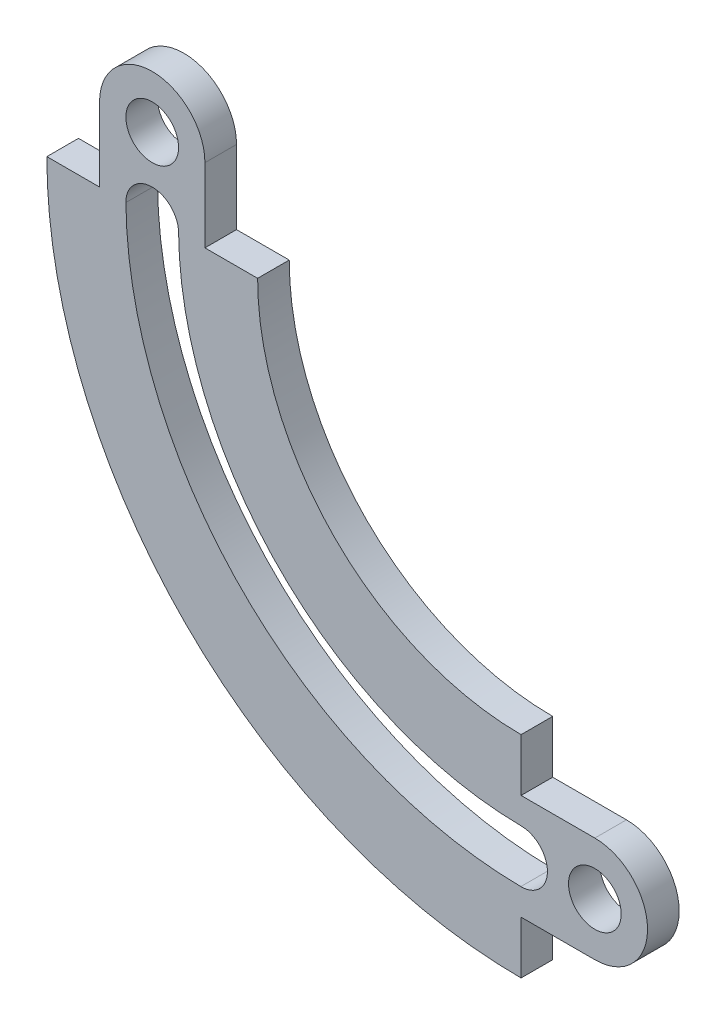
ISO-10303-21;
HEADER;
FILE_DESCRIPTION(('STEP AP214'),'2;1');
FILE_NAME('part.step','',(''),(''),'','','');
FILE_SCHEMA(('AUTOMOTIVE_DESIGN { 1 0 10303 214 1 1 1 1 }'));
ENDSEC;
DATA;
#1=APPLICATION_CONTEXT('core data for automotive mechanical design processes');
#2=APPLICATION_PROTOCOL_DEFINITION('international standard','automotive_design',2000,#1);
#3=PRODUCT_CONTEXT('',#1,'mechanical');
#4=PRODUCT('Part','Part','',(#3));
#5=PRODUCT_RELATED_PRODUCT_CATEGORY('part','',(#4));
#6=PRODUCT_DEFINITION_FORMATION('','',#4);
#7=PRODUCT_DEFINITION_CONTEXT('part definition',#1,'design');
#8=PRODUCT_DEFINITION('design','',#6,#7);
#9=PRODUCT_DEFINITION_SHAPE('','',#8);
#10=(LENGTH_UNIT() NAMED_UNIT(*) SI_UNIT(.MILLI.,.METRE.));
#11=(NAMED_UNIT(*) PLANE_ANGLE_UNIT() SI_UNIT($,.RADIAN.));
#12=(NAMED_UNIT(*) SI_UNIT($,.STERADIAN.) SOLID_ANGLE_UNIT());
#13=UNCERTAINTY_MEASURE_WITH_UNIT(LENGTH_MEASURE(1.E-05),#10,'distance_accuracy_value','');
#14=(GEOMETRIC_REPRESENTATION_CONTEXT(3) GLOBAL_UNCERTAINTY_ASSIGNED_CONTEXT((#13)) GLOBAL_UNIT_ASSIGNED_CONTEXT((#10,
#11,#12)) REPRESENTATION_CONTEXT('',''));
#15=CARTESIAN_POINT('',(0.,0.,0.));
#16=DIRECTION('',(0.,0.,1.));
#17=DIRECTION('',(1.,0.,0.));
#18=AXIS2_PLACEMENT_3D('',#15,#16,#17);
#19=CARTESIAN_POINT('',(0.,89.9999999999979,6.));
#20=DIRECTION('',(0.,0.,1.));
#21=DIRECTION('',(1.,0.,0.));
#22=AXIS2_PLACEMENT_3D('',#19,#20,#21);
#23=PLANE('',#22);
#24=CARTESIAN_POINT('',(-69.9999999999955,103.999999999991,6.));
#25=DIRECTION('',(0.,0.,1.));
#26=DIRECTION('',(1.,0.,0.));
#27=AXIS2_PLACEMENT_3D('',#24,#25,#26);
#28=CIRCLE('',#27,5.00000000000001);
#29=CARTESIAN_POINT('',(-64.9999999999955,103.999999999991,6.));
#30=VERTEX_POINT('',#29);
#31=EDGE_CURVE('E188',#30,#30,#28,.T.);
#32=ORIENTED_EDGE('',*,*,#31,.F.);
#33=EDGE_LOOP('',(#32));
#34=FACE_BOUND('',#33,.T.);
#35=CARTESIAN_POINT('',(14.,20.,6.));
#36=DIRECTION('',(0.,0.,1.));
#37=DIRECTION('',(1.,0.,0.));
#38=AXIS2_PLACEMENT_3D('',#35,#36,#37);
#39=CIRCLE('',#38,5.);
#40=CARTESIAN_POINT('',(19.,20.,6.));
#41=VERTEX_POINT('',#40);
#42=EDGE_CURVE('E168',#41,#41,#39,.T.);
#43=ORIENTED_EDGE('',*,*,#42,.F.);
#44=EDGE_LOOP('',(#43));
#45=FACE_BOUND('',#44,.T.);
#46=CARTESIAN_POINT('',(0.,89.9999999999979,6.));
#47=DIRECTION('',(0.,0.,-1.));
#48=DIRECTION('',(1.,0.,0.));
#49=AXIS2_PLACEMENT_3D('',#46,#47,#48);
#50=CIRCLE('',#49,49.9999999999979);
#51=CARTESIAN_POINT('',(0.,40.,6.));
#52=VERTEX_POINT('',#51);
#53=CARTESIAN_POINT('',(-49.9999999999979,89.9999999999978,6.));
#54=VERTEX_POINT('',#53);
#55=EDGE_CURVE('E200',#52,#54,#50,.T.);
#56=ORIENTED_EDGE('',*,*,#55,.T.);
#57=DIRECTION('',(-1.,0.,0.));
#58=VECTOR('',#57,1.);
#59=CARTESIAN_POINT('',(-49.9999999999979,89.9999999999978,6.));
#60=LINE('',#59,#58);
#61=CARTESIAN_POINT('',(-59.9999999999979,89.9999999999978,6.));
#62=VERTEX_POINT('',#61);
#63=EDGE_CURVE('E203',#54,#62,#60,.T.);
#64=ORIENTED_EDGE('',*,*,#63,.T.);
#65=DIRECTION('',(0.,1.,0.));
#66=VECTOR('',#65,1.);
#67=CARTESIAN_POINT('',(-59.9999999999979,89.9999999999978,6.));
#68=LINE('',#67,#66);
#69=CARTESIAN_POINT('',(-59.9999999999979,103.999999999998,6.));
#70=VERTEX_POINT('',#69);
#71=EDGE_CURVE('E206',#62,#70,#68,.T.);
#72=ORIENTED_EDGE('',*,*,#71,.T.);
#73=CARTESIAN_POINT('',(-69.9999999999979,103.999999999998,6.));
#74=DIRECTION('',(0.,0.,1.));
#75=DIRECTION('',(-1.,0.,0.));
#76=AXIS2_PLACEMENT_3D('',#73,#74,#75);
#77=CIRCLE('',#76,10.);
#78=CARTESIAN_POINT('',(-79.9999999999979,103.999999999998,6.));
#79=VERTEX_POINT('',#78);
#80=EDGE_CURVE('E208',#70,#79,#77,.T.);
#81=ORIENTED_EDGE('',*,*,#80,.T.);
#82=DIRECTION('',(0.,-1.,0.));
#83=VECTOR('',#82,1.);
#84=CARTESIAN_POINT('',(-79.9999999999979,89.9999999999978,6.));
#85=LINE('',#84,#83);
#86=CARTESIAN_POINT('',(-79.9999999999979,89.9999999999978,6.));
#87=VERTEX_POINT('',#86);
#88=EDGE_CURVE('E210',#79,#87,#85,.T.);
#89=ORIENTED_EDGE('',*,*,#88,.T.);
#90=DIRECTION('',(-1.,3.87190279837876E-13,0.));
#91=VECTOR('',#90,1.);
#92=CARTESIAN_POINT('',(-79.9999999999979,89.9999999999978,6.));
#93=LINE('',#92,#91);
#94=CARTESIAN_POINT('',(-90.0000000000017,90.0000000000017,6.));
#95=VERTEX_POINT('',#94);
#96=EDGE_CURVE('E212',#87,#95,#93,.T.);
#97=ORIENTED_EDGE('',*,*,#96,.T.);
#98=CARTESIAN_POINT('',(-3.83026943495679E-12,89.9999999999979,6.));
#99=DIRECTION('',(0.,0.,1.));
#100=DIRECTION('',(1.,0.,0.));
#101=AXIS2_PLACEMENT_3D('',#98,#99,#100);
#102=CIRCLE('',#101,89.9999999999979);
#103=CARTESIAN_POINT('',(0.,0.,6.));
#104=VERTEX_POINT('',#103);
#105=EDGE_CURVE('E214',#95,#104,#102,.T.);
#106=ORIENTED_EDGE('',*,*,#105,.T.);
#107=DIRECTION('',(0.,1.,0.));
#108=VECTOR('',#107,1.);
#109=CARTESIAN_POINT('',(0.,10.,6.));
#110=LINE('',#109,#108);
#111=CARTESIAN_POINT('',(0.,10.,6.));
#112=VERTEX_POINT('',#111);
#113=EDGE_CURVE('E216',#104,#112,#110,.T.);
#114=ORIENTED_EDGE('',*,*,#113,.T.);
#115=DIRECTION('',(1.,0.,0.));
#116=VECTOR('',#115,1.);
#117=CARTESIAN_POINT('',(0.,10.,6.));
#118=LINE('',#117,#116);
#119=CARTESIAN_POINT('',(14.,10.,6.));
#120=VERTEX_POINT('',#119);
#121=EDGE_CURVE('E218',#112,#120,#118,.T.);
#122=ORIENTED_EDGE('',*,*,#121,.T.);
#123=CARTESIAN_POINT('',(14.,20.,6.));
#124=DIRECTION('',(0.,0.,1.));
#125=DIRECTION('',(-1.,0.,0.));
#126=AXIS2_PLACEMENT_3D('',#123,#124,#125);
#127=CIRCLE('',#126,10.);
#128=CARTESIAN_POINT('',(14.,30.,6.));
#129=VERTEX_POINT('',#128);
#130=EDGE_CURVE('E220',#120,#129,#127,.T.);
#131=ORIENTED_EDGE('',*,*,#130,.T.);
#132=DIRECTION('',(-1.,0.,0.));
#133=VECTOR('',#132,1.);
#134=CARTESIAN_POINT('',(0.,30.,6.));
#135=LINE('',#134,#133);
#136=CARTESIAN_POINT('',(0.,30.,6.));
#137=VERTEX_POINT('',#136);
#138=EDGE_CURVE('E222',#129,#137,#135,.T.);
#139=ORIENTED_EDGE('',*,*,#138,.T.);
#140=DIRECTION('',(0.,1.,0.));
#141=VECTOR('',#140,1.);
#142=CARTESIAN_POINT('',(0.,40.,6.));
#143=LINE('',#142,#141);
#144=EDGE_CURVE('E224',#137,#52,#143,.T.);
#145=ORIENTED_EDGE('',*,*,#144,.T.);
#146=EDGE_LOOP('',(#56,#64,#72,#81,#89,#97,#106,#114,#122,#131,#139,#145));
#147=FACE_BOUND('',#146,.T.);
#148=CARTESIAN_POINT('',(0.67932122736538,90.6793212273633,6.));
#149=DIRECTION('',(0.,0.,1.));
#150=DIRECTION('',(1.,0.,0.));
#151=AXIS2_PLACEMENT_3D('',#148,#149,#150);
#152=CIRCLE('',#151,75.6823548188695);
#153=CARTESIAN_POINT('',(-74.9995381420888,89.9519454870217,6.));
#154=VERTEX_POINT('',#153);
#155=CARTESIAN_POINT('',(-0.0480545129761748,15.0004618579091,6.));
#156=VERTEX_POINT('',#155);
#157=EDGE_CURVE('E160',#154,#156,#152,.T.);
#158=ORIENTED_EDGE('',*,*,#157,.F.);
#159=CARTESIAN_POINT('',(-69.9997690710433,89.9999999999978,6.));
#160=DIRECTION('',(0.,0.,1.));
#161=DIRECTION('',(1.,0.,0.));
#162=AXIS2_PLACEMENT_3D('',#159,#160,#161);
#163=CIRCLE('',#162,5.);
#164=CARTESIAN_POINT('',(-64.9999999999979,90.048054512974,6.));
#165=VERTEX_POINT('',#164);
#166=EDGE_CURVE('E152',#165,#154,#163,.T.);
#167=ORIENTED_EDGE('',*,*,#166,.F.);
#168=CARTESIAN_POINT('',(0.67932122736538,90.6793212273633,6.));
#169=DIRECTION('',(0.,0.,-1.));
#170=DIRECTION('',(1.,0.,0.));
#171=AXIS2_PLACEMENT_3D('',#168,#169,#170);
#172=CIRCLE('',#171,65.6823548188695);
#173=CARTESIAN_POINT('',(0.048054512976134,25.,6.));
#174=VERTEX_POINT('',#173);
#175=EDGE_CURVE('E174',#174,#165,#172,.T.);
#176=ORIENTED_EDGE('',*,*,#175,.F.);
#177=CARTESIAN_POINT('',(0.,20.0002309289546,6.));
#178=DIRECTION('',(0.,0.,1.));
#179=DIRECTION('',(1.,0.,0.));
#180=AXIS2_PLACEMENT_3D('',#177,#178,#179);
#181=CIRCLE('',#180,5.);
#182=EDGE_CURVE('E172',#156,#174,#181,.T.);
#183=ORIENTED_EDGE('',*,*,#182,.F.);
#184=EDGE_LOOP('',(#158,#167,#176,#183));
#185=FACE_BOUND('',#184,.T.);
#186=ADVANCED_FACE('F39',(#34,#45,#147,#185),#23,.T.);
#187=CARTESIAN_POINT('',(0.,89.9999999999979,0.));
#188=DIRECTION('',(0.,0.,1.));
#189=DIRECTION('',(1.,0.,0.));
#190=AXIS2_PLACEMENT_3D('',#187,#188,#189);
#191=PLANE('',#190);
#192=CARTESIAN_POINT('',(0.,89.9999999999979,0.));
#193=DIRECTION('',(0.,0.,-1.));
#194=DIRECTION('',(1.,0.,0.));
#195=AXIS2_PLACEMENT_3D('',#192,#193,#194);
#196=CIRCLE('',#195,49.9999999999979);
#197=CARTESIAN_POINT('',(0.,40.,0.));
#198=VERTEX_POINT('',#197);
#199=CARTESIAN_POINT('',(-49.9999999999979,89.9999999999978,0.));
#200=VERTEX_POINT('',#199);
#201=EDGE_CURVE('E191',#198,#200,#196,.T.);
#202=ORIENTED_EDGE('',*,*,#201,.F.);
#203=DIRECTION('',(0.,1.,0.));
#204=VECTOR('',#203,1.);
#205=CARTESIAN_POINT('',(0.,40.,0.));
#206=LINE('',#205,#204);
#207=CARTESIAN_POINT('',(0.,30.,0.));
#208=VERTEX_POINT('',#207);
#209=EDGE_CURVE('E204',#208,#198,#206,.T.);
#210=ORIENTED_EDGE('',*,*,#209,.F.);
#211=DIRECTION('',(-1.,0.,0.));
#212=VECTOR('',#211,1.);
#213=CARTESIAN_POINT('',(0.,30.,0.));
#214=LINE('',#213,#212);
#215=CARTESIAN_POINT('',(14.,30.,0.));
#216=VERTEX_POINT('',#215);
#217=EDGE_CURVE('E247',#216,#208,#214,.T.);
#218=ORIENTED_EDGE('',*,*,#217,.F.);
#219=CARTESIAN_POINT('',(14.,20.,0.));
#220=DIRECTION('',(0.,0.,1.));
#221=DIRECTION('',(-1.,0.,0.));
#222=AXIS2_PLACEMENT_3D('',#219,#220,#221);
#223=CIRCLE('',#222,10.);
#224=CARTESIAN_POINT('',(14.,10.,0.));
#225=VERTEX_POINT('',#224);
#226=EDGE_CURVE('E245',#225,#216,#223,.T.);
#227=ORIENTED_EDGE('',*,*,#226,.F.);
#228=DIRECTION('',(1.,0.,0.));
#229=VECTOR('',#228,1.);
#230=CARTESIAN_POINT('',(0.,10.,0.));
#231=LINE('',#230,#229);
#232=CARTESIAN_POINT('',(0.,10.,0.));
#233=VERTEX_POINT('',#232);
#234=EDGE_CURVE('E243',#233,#225,#231,.T.);
#235=ORIENTED_EDGE('',*,*,#234,.F.);
#236=DIRECTION('',(0.,1.,0.));
#237=VECTOR('',#236,1.);
#238=CARTESIAN_POINT('',(0.,10.,0.));
#239=LINE('',#238,#237);
#240=CARTESIAN_POINT('',(0.,0.,0.));
#241=VERTEX_POINT('',#240);
#242=EDGE_CURVE('E241',#241,#233,#239,.T.);
#243=ORIENTED_EDGE('',*,*,#242,.F.);
#244=CARTESIAN_POINT('',(-3.83026943495679E-12,89.9999999999979,0.));
#245=DIRECTION('',(0.,0.,1.));
#246=DIRECTION('',(1.,0.,0.));
#247=AXIS2_PLACEMENT_3D('',#244,#245,#246);
#248=CIRCLE('',#247,89.9999999999979);
#249=CARTESIAN_POINT('',(-90.0000000000017,90.0000000000017,0.));
#250=VERTEX_POINT('',#249);
#251=EDGE_CURVE('E239',#250,#241,#248,.T.);
#252=ORIENTED_EDGE('',*,*,#251,.F.);
#253=DIRECTION('',(-1.,3.87190279837876E-13,0.));
#254=VECTOR('',#253,1.);
#255=CARTESIAN_POINT('',(-79.9999999999979,89.9999999999978,0.));
#256=LINE('',#255,#254);
#257=CARTESIAN_POINT('',(-79.9999999999979,89.9999999999978,0.));
#258=VERTEX_POINT('',#257);
#259=EDGE_CURVE('E237',#258,#250,#256,.T.);
#260=ORIENTED_EDGE('',*,*,#259,.F.);
#261=DIRECTION('',(0.,-1.,0.));
#262=VECTOR('',#261,1.);
#263=CARTESIAN_POINT('',(-79.9999999999979,89.9999999999978,0.));
#264=LINE('',#263,#262);
#265=CARTESIAN_POINT('',(-79.9999999999979,103.999999999998,0.));
#266=VERTEX_POINT('',#265);
#267=EDGE_CURVE('E235',#266,#258,#264,.T.);
#268=ORIENTED_EDGE('',*,*,#267,.F.);
#269=CARTESIAN_POINT('',(-69.9999999999979,103.999999999998,0.));
#270=DIRECTION('',(0.,0.,1.));
#271=DIRECTION('',(-1.,0.,0.));
#272=AXIS2_PLACEMENT_3D('',#269,#270,#271);
#273=CIRCLE('',#272,10.);
#274=CARTESIAN_POINT('',(-59.9999999999979,103.999999999998,0.));
#275=VERTEX_POINT('',#274);
#276=EDGE_CURVE('E233',#275,#266,#273,.T.);
#277=ORIENTED_EDGE('',*,*,#276,.F.);
#278=DIRECTION('',(0.,1.,0.));
#279=VECTOR('',#278,1.);
#280=CARTESIAN_POINT('',(-59.9999999999979,89.9999999999978,0.));
#281=LINE('',#280,#279);
#282=CARTESIAN_POINT('',(-59.9999999999979,89.9999999999978,0.));
#283=VERTEX_POINT('',#282);
#284=EDGE_CURVE('E231',#283,#275,#281,.T.);
#285=ORIENTED_EDGE('',*,*,#284,.F.);
#286=DIRECTION('',(-1.,0.,0.));
#287=VECTOR('',#286,1.);
#288=CARTESIAN_POINT('',(-49.9999999999979,89.9999999999978,0.));
#289=LINE('',#288,#287);
#290=EDGE_CURVE('E229',#200,#283,#289,.T.);
#291=ORIENTED_EDGE('',*,*,#290,.F.);
#292=EDGE_LOOP('',(#202,#210,#218,#227,#235,#243,#252,#260,#268,#277,#285,#291));
#293=FACE_BOUND('',#292,.T.);
#294=CARTESIAN_POINT('',(14.,20.,0.));
#295=DIRECTION('',(0.,0.,1.));
#296=DIRECTION('',(1.,0.,0.));
#297=AXIS2_PLACEMENT_3D('',#294,#295,#296);
#298=CIRCLE('',#297,5.);
#299=CARTESIAN_POINT('',(19.,20.,0.));
#300=VERTEX_POINT('',#299);
#301=EDGE_CURVE('E195',#300,#300,#298,.T.);
#302=ORIENTED_EDGE('',*,*,#301,.T.);
#303=EDGE_LOOP('',(#302));
#304=FACE_BOUND('',#303,.T.);
#305=CARTESIAN_POINT('',(-69.9999999999955,103.999999999991,0.));
#306=DIRECTION('',(0.,0.,1.));
#307=DIRECTION('',(1.,0.,0.));
#308=AXIS2_PLACEMENT_3D('',#305,#306,#307);
#309=CIRCLE('',#308,5.00000000000001);
#310=CARTESIAN_POINT('',(-64.9999999999955,103.999999999991,0.));
#311=VERTEX_POINT('',#310);
#312=EDGE_CURVE('E192',#311,#311,#309,.T.);
#313=ORIENTED_EDGE('',*,*,#312,.T.);
#314=EDGE_LOOP('',(#313));
#315=FACE_BOUND('',#314,.T.);
#316=CARTESIAN_POINT('',(-69.9997690710433,89.9999999999978,0.));
#317=DIRECTION('',(0.,0.,1.));
#318=DIRECTION('',(1.,0.,0.));
#319=AXIS2_PLACEMENT_3D('',#316,#317,#318);
#320=CIRCLE('',#319,5.);
#321=CARTESIAN_POINT('',(-64.9999999999979,90.048054512974,0.));
#322=VERTEX_POINT('',#321);
#323=CARTESIAN_POINT('',(-74.9995381420888,89.9519454870217,0.));
#324=VERTEX_POINT('',#323);
#325=EDGE_CURVE('E62',#322,#324,#320,.T.);
#326=ORIENTED_EDGE('',*,*,#325,.T.);
#327=CARTESIAN_POINT('',(0.67932122736538,90.6793212273633,0.));
#328=DIRECTION('',(0.,0.,1.));
#329=DIRECTION('',(1.,0.,0.));
#330=AXIS2_PLACEMENT_3D('',#327,#328,#329);
#331=CIRCLE('',#330,75.6823548188695);
#332=CARTESIAN_POINT('',(-0.0480545129761748,15.0004618579091,0.));
#333=VERTEX_POINT('',#332);
#334=EDGE_CURVE('E167',#324,#333,#331,.T.);
#335=ORIENTED_EDGE('',*,*,#334,.T.);
#336=CARTESIAN_POINT('',(0.,20.0002309289546,0.));
#337=DIRECTION('',(0.,0.,1.));
#338=DIRECTION('',(1.,0.,0.));
#339=AXIS2_PLACEMENT_3D('',#336,#337,#338);
#340=CIRCLE('',#339,5.);
#341=CARTESIAN_POINT('',(0.0480545129761338,25.,0.));
#342=VERTEX_POINT('',#341);
#343=EDGE_CURVE('E180',#333,#342,#340,.T.);
#344=ORIENTED_EDGE('',*,*,#343,.T.);
#345=CARTESIAN_POINT('',(0.67932122736538,90.6793212273633,0.));
#346=DIRECTION('',(0.,0.,-1.));
#347=DIRECTION('',(1.,0.,0.));
#348=AXIS2_PLACEMENT_3D('',#345,#346,#347);
#349=CIRCLE('',#348,65.6823548188695);
#350=EDGE_CURVE('E161',#342,#322,#349,.T.);
#351=ORIENTED_EDGE('',*,*,#350,.T.);
#352=EDGE_LOOP('',(#326,#335,#344,#351));
#353=FACE_BOUND('',#352,.T.);
#354=ADVANCED_FACE('F289',(#293,#304,#315,#353),#191,.F.);
#355=CARTESIAN_POINT('',(0.,89.9999999999979,6.));
#356=DIRECTION('',(0.,0.,-1.));
#357=DIRECTION('',(-1.,0.,0.));
#358=AXIS2_PLACEMENT_3D('',#355,#356,#357);
#359=CYLINDRICAL_SURFACE('',#358,49.9999999999979);
#360=ORIENTED_EDGE('',*,*,#201,.T.);
#361=DIRECTION('',(0.,0.,-1.));
#362=VECTOR('',#361,1.);
#363=CARTESIAN_POINT('',(-49.9999999999979,89.9999999999978,6.));
#364=LINE('',#363,#362);
#365=EDGE_CURVE('E11',#54,#200,#364,.T.);
#366=ORIENTED_EDGE('',*,*,#365,.F.);
#367=ORIENTED_EDGE('',*,*,#55,.F.);
#368=DIRECTION('',(0.,0.,-1.));
#369=VECTOR('',#368,1.);
#370=CARTESIAN_POINT('',(0.,40.,6.));
#371=LINE('',#370,#369);
#372=EDGE_CURVE('E226',#52,#198,#371,.T.);
#373=ORIENTED_EDGE('',*,*,#372,.T.);
#374=EDGE_LOOP('',(#360,#366,#367,#373));
#375=FACE_BOUND('',#374,.T.);
#376=ADVANCED_FACE('F41',(#375),#359,.F.);
#377=CARTESIAN_POINT('',(-49.9999999999979,89.9999999999978,6.));
#378=DIRECTION('',(0.,-1.,0.));
#379=DIRECTION('',(1.,0.,0.));
#380=AXIS2_PLACEMENT_3D('',#377,#378,#379);
#381=PLANE('',#380);
#382=ORIENTED_EDGE('',*,*,#290,.T.);
#383=DIRECTION('',(0.,0.,-1.));
#384=VECTOR('',#383,1.);
#385=CARTESIAN_POINT('',(-59.9999999999979,89.9999999999978,6.));
#386=LINE('',#385,#384);
#387=EDGE_CURVE('E47',#62,#283,#386,.T.);
#388=ORIENTED_EDGE('',*,*,#387,.F.);
#389=ORIENTED_EDGE('',*,*,#63,.F.);
#390=ORIENTED_EDGE('',*,*,#365,.T.);
#391=EDGE_LOOP('',(#382,#388,#389,#390));
#392=FACE_BOUND('',#391,.T.);
#393=ADVANCED_FACE('F306',(#392),#381,.F.);
#394=CARTESIAN_POINT('',(-59.9999999999979,89.9999999999978,6.));
#395=DIRECTION('',(-1.,0.,0.));
#396=DIRECTION('',(0.,0.,1.));
#397=AXIS2_PLACEMENT_3D('',#394,#395,#396);
#398=PLANE('',#397);
#399=ORIENTED_EDGE('',*,*,#284,.T.);
#400=DIRECTION('',(0.,0.,-1.));
#401=VECTOR('',#400,1.);
#402=CARTESIAN_POINT('',(-59.9999999999979,103.999999999998,6.));
#403=LINE('',#402,#401);
#404=EDGE_CURVE('E276',#70,#275,#403,.T.);
#405=ORIENTED_EDGE('',*,*,#404,.F.);
#406=ORIENTED_EDGE('',*,*,#71,.F.);
#407=ORIENTED_EDGE('',*,*,#387,.T.);
#408=EDGE_LOOP('',(#399,#405,#406,#407));
#409=FACE_BOUND('',#408,.T.);
#410=ADVANCED_FACE('F283',(#409),#398,.F.);
#411=CARTESIAN_POINT('',(-69.9999999999979,103.999999999998,6.));
#412=DIRECTION('',(0.,0.,-1.));
#413=DIRECTION('',(-1.,0.,0.));
#414=AXIS2_PLACEMENT_3D('',#411,#412,#413);
#415=CYLINDRICAL_SURFACE('',#414,10.);
#416=ORIENTED_EDGE('',*,*,#276,.T.);
#417=DIRECTION('',(0.,0.,-1.));
#418=VECTOR('',#417,1.);
#419=CARTESIAN_POINT('',(-79.9999999999979,103.999999999998,6.));
#420=LINE('',#419,#418);
#421=EDGE_CURVE('E273',#79,#266,#420,.T.);
#422=ORIENTED_EDGE('',*,*,#421,.F.);
#423=ORIENTED_EDGE('',*,*,#80,.F.);
#424=ORIENTED_EDGE('',*,*,#404,.T.);
#425=EDGE_LOOP('',(#416,#422,#423,#424));
#426=FACE_BOUND('',#425,.T.);
#427=ADVANCED_FACE('F295',(#426),#415,.T.);
#428=CARTESIAN_POINT('',(-79.9999999999979,89.9999999999978,6.));
#429=DIRECTION('',(1.,0.,0.));
#430=DIRECTION('',(0.,0.,-1.));
#431=AXIS2_PLACEMENT_3D('',#428,#429,#430);
#432=PLANE('',#431);
#433=ORIENTED_EDGE('',*,*,#267,.T.);
#434=DIRECTION('',(0.,0.,-1.));
#435=VECTOR('',#434,1.);
#436=CARTESIAN_POINT('',(-79.9999999999979,89.9999999999978,6.));
#437=LINE('',#436,#435);
#438=EDGE_CURVE('E270',#87,#258,#437,.T.);
#439=ORIENTED_EDGE('',*,*,#438,.F.);
#440=ORIENTED_EDGE('',*,*,#88,.F.);
#441=ORIENTED_EDGE('',*,*,#421,.T.);
#442=EDGE_LOOP('',(#433,#439,#440,#441));
#443=FACE_BOUND('',#442,.T.);
#444=ADVANCED_FACE('F299',(#443),#432,.F.);
#445=CARTESIAN_POINT('',(-79.9999999999979,89.9999999999978,6.));
#446=DIRECTION('',(-3.87190279837876E-13,-1.,0.));
#447=DIRECTION('',(1.,-3.87190279837876E-13,0.));
#448=AXIS2_PLACEMENT_3D('',#445,#446,#447);
#449=PLANE('',#448);
#450=ORIENTED_EDGE('',*,*,#259,.T.);
#451=DIRECTION('',(0.,0.,-1.));
#452=VECTOR('',#451,1.);
#453=CARTESIAN_POINT('',(-90.0000000000017,90.0000000000017,6.));
#454=LINE('',#453,#452);
#455=EDGE_CURVE('E267',#95,#250,#454,.T.);
#456=ORIENTED_EDGE('',*,*,#455,.F.);
#457=ORIENTED_EDGE('',*,*,#96,.F.);
#458=ORIENTED_EDGE('',*,*,#438,.T.);
#459=EDGE_LOOP('',(#450,#456,#457,#458));
#460=FACE_BOUND('',#459,.T.);
#461=ADVANCED_FACE('F339',(#460),#449,.F.);
#462=CARTESIAN_POINT('',(-3.83026943495679E-12,89.9999999999979,6.));
#463=DIRECTION('',(0.,0.,-1.));
#464=DIRECTION('',(-1.,0.,0.));
#465=AXIS2_PLACEMENT_3D('',#462,#463,#464);
#466=CYLINDRICAL_SURFACE('',#465,89.9999999999979);
#467=ORIENTED_EDGE('',*,*,#251,.T.);
#468=DIRECTION('',(0.,0.,-1.));
#469=VECTOR('',#468,1.);
#470=CARTESIAN_POINT('',(0.,0.,6.));
#471=LINE('',#470,#469);
#472=EDGE_CURVE('E264',#104,#241,#471,.T.);
#473=ORIENTED_EDGE('',*,*,#472,.F.);
#474=ORIENTED_EDGE('',*,*,#105,.F.);
#475=ORIENTED_EDGE('',*,*,#455,.T.);
#476=EDGE_LOOP('',(#467,#473,#474,#475));
#477=FACE_BOUND('',#476,.T.);
#478=ADVANCED_FACE('F337',(#477),#466,.T.);
#479=CARTESIAN_POINT('',(0.,10.,6.));
#480=DIRECTION('',(-1.,0.,0.));
#481=DIRECTION('',(0.,-1.,0.));
#482=AXIS2_PLACEMENT_3D('',#479,#480,#481);
#483=PLANE('',#482);
#484=ORIENTED_EDGE('',*,*,#242,.T.);
#485=DIRECTION('',(0.,0.,-1.));
#486=VECTOR('',#485,1.);
#487=CARTESIAN_POINT('',(0.,10.,6.));
#488=LINE('',#487,#486);
#489=EDGE_CURVE('E261',#112,#233,#488,.T.);
#490=ORIENTED_EDGE('',*,*,#489,.F.);
#491=ORIENTED_EDGE('',*,*,#113,.F.);
#492=ORIENTED_EDGE('',*,*,#472,.T.);
#493=EDGE_LOOP('',(#484,#490,#491,#492));
#494=FACE_BOUND('',#493,.T.);
#495=ADVANCED_FACE('F333',(#494),#483,.F.);
#496=CARTESIAN_POINT('',(0.,10.,6.));
#497=DIRECTION('',(0.,1.,0.));
#498=DIRECTION('',(0.,0.,1.));
#499=AXIS2_PLACEMENT_3D('',#496,#497,#498);
#500=PLANE('',#499);
#501=ORIENTED_EDGE('',*,*,#234,.T.);
#502=DIRECTION('',(0.,0.,-1.));
#503=VECTOR('',#502,1.);
#504=CARTESIAN_POINT('',(14.,10.,6.));
#505=LINE('',#504,#503);
#506=EDGE_CURVE('E258',#120,#225,#505,.T.);
#507=ORIENTED_EDGE('',*,*,#506,.F.);
#508=ORIENTED_EDGE('',*,*,#121,.F.);
#509=ORIENTED_EDGE('',*,*,#489,.T.);
#510=EDGE_LOOP('',(#501,#507,#508,#509));
#511=FACE_BOUND('',#510,.T.);
#512=ADVANCED_FACE('F328',(#511),#500,.F.);
#513=CARTESIAN_POINT('',(14.,20.,6.));
#514=DIRECTION('',(0.,0.,-1.));
#515=DIRECTION('',(-1.,0.,0.));
#516=AXIS2_PLACEMENT_3D('',#513,#514,#515);
#517=CYLINDRICAL_SURFACE('',#516,10.);
#518=ORIENTED_EDGE('',*,*,#226,.T.);
#519=DIRECTION('',(0.,0.,-1.));
#520=VECTOR('',#519,1.);
#521=CARTESIAN_POINT('',(14.,30.,6.));
#522=LINE('',#521,#520);
#523=EDGE_CURVE('E255',#129,#216,#522,.T.);
#524=ORIENTED_EDGE('',*,*,#523,.F.);
#525=ORIENTED_EDGE('',*,*,#130,.F.);
#526=ORIENTED_EDGE('',*,*,#506,.T.);
#527=EDGE_LOOP('',(#518,#524,#525,#526));
#528=FACE_BOUND('',#527,.T.);
#529=ADVANCED_FACE('F322',(#528),#517,.T.);
#530=CARTESIAN_POINT('',(0.,30.,6.));
#531=DIRECTION('',(0.,-1.,0.));
#532=DIRECTION('',(1.,0.,0.));
#533=AXIS2_PLACEMENT_3D('',#530,#531,#532);
#534=PLANE('',#533);
#535=ORIENTED_EDGE('',*,*,#217,.T.);
#536=DIRECTION('',(0.,0.,-1.));
#537=VECTOR('',#536,1.);
#538=CARTESIAN_POINT('',(0.,30.,6.));
#539=LINE('',#538,#537);
#540=EDGE_CURVE('E252',#137,#208,#539,.T.);
#541=ORIENTED_EDGE('',*,*,#540,.F.);
#542=ORIENTED_EDGE('',*,*,#138,.F.);
#543=ORIENTED_EDGE('',*,*,#523,.T.);
#544=EDGE_LOOP('',(#535,#541,#542,#543));
#545=FACE_BOUND('',#544,.T.);
#546=ADVANCED_FACE('F318',(#545),#534,.F.);
#547=CARTESIAN_POINT('',(0.,40.,6.));
#548=DIRECTION('',(-1.,0.,0.));
#549=DIRECTION('',(0.,-1.,0.));
#550=AXIS2_PLACEMENT_3D('',#547,#548,#549);
#551=PLANE('',#550);
#552=ORIENTED_EDGE('',*,*,#209,.T.);
#553=ORIENTED_EDGE('',*,*,#372,.F.);
#554=ORIENTED_EDGE('',*,*,#144,.F.);
#555=ORIENTED_EDGE('',*,*,#540,.T.);
#556=EDGE_LOOP('',(#552,#553,#554,#555));
#557=FACE_BOUND('',#556,.T.);
#558=ADVANCED_FACE('F313',(#557),#551,.F.);
#559=CARTESIAN_POINT('',(14.,20.,6.));
#560=DIRECTION('',(0.,0.,-1.));
#561=DIRECTION('',(-1.,0.,0.));
#562=AXIS2_PLACEMENT_3D('',#559,#560,#561);
#563=CYLINDRICAL_SURFACE('',#562,5.);
#564=ORIENTED_EDGE('',*,*,#42,.T.);
#565=EDGE_LOOP('',(#564));
#566=FACE_BOUND('',#565,.T.);
#567=ORIENTED_EDGE('',*,*,#301,.F.);
#568=EDGE_LOOP('',(#567));
#569=FACE_BOUND('',#568,.T.);
#570=ADVANCED_FACE('F359',(#566,#569),#563,.F.);
#571=CARTESIAN_POINT('',(-69.9999999999955,103.999999999991,6.));
#572=DIRECTION('',(0.,0.,-1.));
#573=DIRECTION('',(-1.,0.,0.));
#574=AXIS2_PLACEMENT_3D('',#571,#572,#573);
#575=CYLINDRICAL_SURFACE('',#574,5.00000000000001);
#576=ORIENTED_EDGE('',*,*,#31,.T.);
#577=EDGE_LOOP('',(#576));
#578=FACE_BOUND('',#577,.T.);
#579=ORIENTED_EDGE('',*,*,#312,.F.);
#580=EDGE_LOOP('',(#579));
#581=FACE_BOUND('',#580,.T.);
#582=ADVANCED_FACE('F401',(#578,#581),#575,.F.);
#583=CARTESIAN_POINT('',(-69.9997690710433,89.9999999999978,6.));
#584=DIRECTION('',(0.,0.,-1.));
#585=DIRECTION('',(-1.,0.,0.));
#586=AXIS2_PLACEMENT_3D('',#583,#584,#585);
#587=CYLINDRICAL_SURFACE('',#586,5.);
#588=ORIENTED_EDGE('',*,*,#325,.F.);
#589=DIRECTION('',(0.,0.,-1.));
#590=VECTOR('',#589,1.);
#591=CARTESIAN_POINT('',(-64.9999999999979,90.048054512974,6.));
#592=LINE('',#591,#590);
#593=EDGE_CURVE('E156',#165,#322,#592,.T.);
#594=ORIENTED_EDGE('',*,*,#593,.F.);
#595=ORIENTED_EDGE('',*,*,#166,.T.);
#596=DIRECTION('',(0.,0.,-1.));
#597=VECTOR('',#596,1.);
#598=CARTESIAN_POINT('',(-74.9995381420888,89.9519454870217,6.));
#599=LINE('',#598,#597);
#600=EDGE_CURVE('E155',#154,#324,#599,.T.);
#601=ORIENTED_EDGE('',*,*,#600,.T.);
#602=EDGE_LOOP('',(#588,#594,#595,#601));
#603=FACE_BOUND('',#602,.T.);
#604=ADVANCED_FACE('F154',(#603),#587,.F.);
#605=CARTESIAN_POINT('',(0.67932122736538,90.6793212273633,6.));
#606=DIRECTION('',(0.,0.,-1.));
#607=DIRECTION('',(-1.,0.,0.));
#608=AXIS2_PLACEMENT_3D('',#605,#606,#607);
#609=CYLINDRICAL_SURFACE('',#608,75.6823548188695);
#610=ORIENTED_EDGE('',*,*,#334,.F.);
#611=ORIENTED_EDGE('',*,*,#600,.F.);
#612=ORIENTED_EDGE('',*,*,#157,.T.);
#613=DIRECTION('',(0.,0.,-1.));
#614=VECTOR('',#613,1.);
#615=CARTESIAN_POINT('',(-0.0480545129761748,15.0004618579091,6.));
#616=LINE('',#615,#614);
#617=EDGE_CURVE('E169',#156,#333,#616,.T.);
#618=ORIENTED_EDGE('',*,*,#617,.T.);
#619=EDGE_LOOP('',(#610,#611,#612,#618));
#620=FACE_BOUND('',#619,.T.);
#621=ADVANCED_FACE('F164',(#620),#609,.F.);
#622=CARTESIAN_POINT('',(0.,20.0002309289546,6.));
#623=DIRECTION('',(0.,0.,-1.));
#624=DIRECTION('',(-1.,0.,0.));
#625=AXIS2_PLACEMENT_3D('',#622,#623,#624);
#626=CYLINDRICAL_SURFACE('',#625,5.);
#627=ORIENTED_EDGE('',*,*,#343,.F.);
#628=ORIENTED_EDGE('',*,*,#617,.F.);
#629=ORIENTED_EDGE('',*,*,#182,.T.);
#630=DIRECTION('',(0.,0.,-1.));
#631=VECTOR('',#630,1.);
#632=CARTESIAN_POINT('',(0.0480545129761338,25.,6.));
#633=LINE('',#632,#631);
#634=EDGE_CURVE('E54',#174,#342,#633,.T.);
#635=ORIENTED_EDGE('',*,*,#634,.T.);
#636=EDGE_LOOP('',(#627,#628,#629,#635));
#637=FACE_BOUND('',#636,.T.);
#638=ADVANCED_FACE('F436',(#637),#626,.F.);
#639=CARTESIAN_POINT('',(0.67932122736538,90.6793212273633,6.));
#640=DIRECTION('',(0.,0.,-1.));
#641=DIRECTION('',(-1.,0.,0.));
#642=AXIS2_PLACEMENT_3D('',#639,#640,#641);
#643=CYLINDRICAL_SURFACE('',#642,65.6823548188695);
#644=ORIENTED_EDGE('',*,*,#350,.F.);
#645=ORIENTED_EDGE('',*,*,#634,.F.);
#646=ORIENTED_EDGE('',*,*,#175,.T.);
#647=ORIENTED_EDGE('',*,*,#593,.T.);
#648=EDGE_LOOP('',(#644,#645,#646,#647));
#649=FACE_BOUND('',#648,.T.);
#650=ADVANCED_FACE('F445',(#649),#643,.T.);
#651=CLOSED_SHELL('',(#186,#354,#376,#393,#410,#427,#444,#461,#478,#495,#512,#529,#546,#558,
#570,#582,#604,#621,#638,#650));
#652=MANIFOLD_SOLID_BREP('B2',#651);
#653=ADVANCED_BREP_SHAPE_REPRESENTATION('',(#18,#652),#14);
#654=SHAPE_DEFINITION_REPRESENTATION(#9,#653);
ENDSEC;
END-ISO-10303-21;
